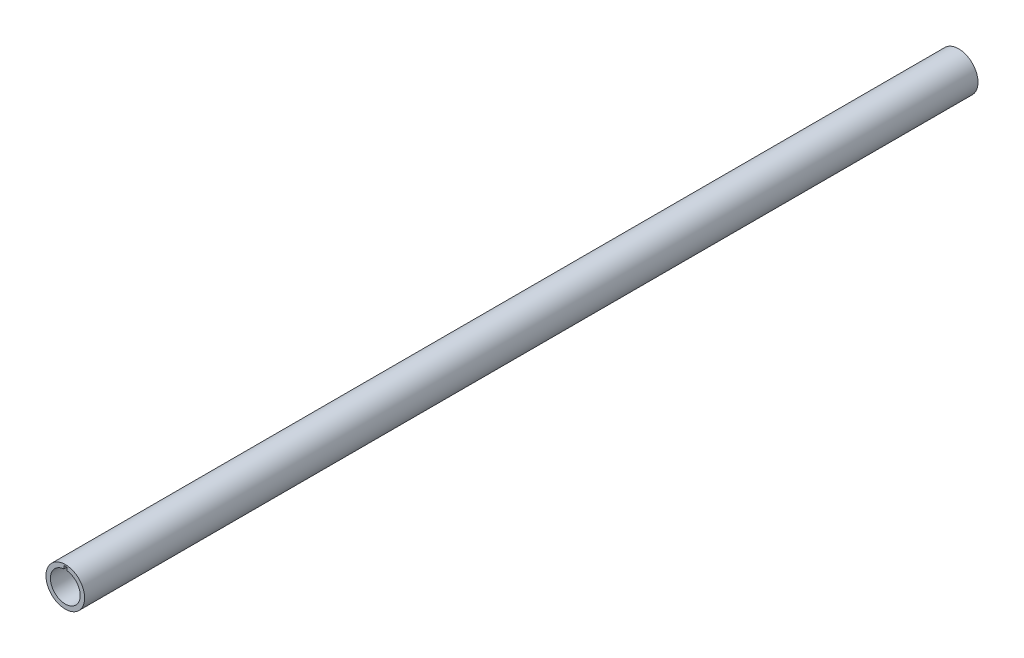
ISO-10303-21;
HEADER;
FILE_DESCRIPTION(('STEP AP214'),'2;1');
FILE_NAME('part.step','',(''),(''),'','','');
FILE_SCHEMA(('AUTOMOTIVE_DESIGN { 1 0 10303 214 1 1 1 1 }'));
ENDSEC;
DATA;
#1=APPLICATION_CONTEXT('core data for automotive mechanical design processes');
#2=APPLICATION_PROTOCOL_DEFINITION('international standard','automotive_design',2000,#1);
#3=PRODUCT_CONTEXT('',#1,'mechanical');
#4=PRODUCT('Part','Part','',(#3));
#5=PRODUCT_RELATED_PRODUCT_CATEGORY('part','',(#4));
#6=PRODUCT_DEFINITION_FORMATION('','',#4);
#7=PRODUCT_DEFINITION_CONTEXT('part definition',#1,'design');
#8=PRODUCT_DEFINITION('design','',#6,#7);
#9=PRODUCT_DEFINITION_SHAPE('','',#8);
#10=(LENGTH_UNIT() NAMED_UNIT(*) SI_UNIT(.MILLI.,.METRE.));
#11=(NAMED_UNIT(*) PLANE_ANGLE_UNIT() SI_UNIT($,.RADIAN.));
#12=(NAMED_UNIT(*) SI_UNIT($,.STERADIAN.) SOLID_ANGLE_UNIT());
#13=UNCERTAINTY_MEASURE_WITH_UNIT(LENGTH_MEASURE(1.E-05),#10,'distance_accuracy_value','');
#14=(GEOMETRIC_REPRESENTATION_CONTEXT(3) GLOBAL_UNCERTAINTY_ASSIGNED_CONTEXT((#13)) GLOBAL_UNIT_ASSIGNED_CONTEXT((#10,
#11,#12)) REPRESENTATION_CONTEXT('',''));
#15=CARTESIAN_POINT('',(0.,0.,0.));
#16=DIRECTION('',(0.,0.,1.));
#17=DIRECTION('',(1.,0.,0.));
#18=AXIS2_PLACEMENT_3D('',#15,#16,#17);
#19=CARTESIAN_POINT('',(0.,0.,600.));
#20=DIRECTION('',(0.,0.,1.));
#21=DIRECTION('',(1.,0.,0.));
#22=AXIS2_PLACEMENT_3D('',#19,#20,#21);
#23=PLANE('',#22);
#24=DIRECTION('',(0.,1.,0.));
#25=VECTOR('',#24,1.);
#26=CARTESIAN_POINT('',(1.,9.9498743710662,600.));
#27=LINE('',#26,#25);
#28=CARTESIAN_POINT('',(1.,9.9498743710662,600.));
#29=VERTEX_POINT('',#28);
#30=CARTESIAN_POINT('',(1.,12.,600.));
#31=VERTEX_POINT('',#30);
#32=EDGE_CURVE('E134',#29,#31,#27,.T.);
#33=ORIENTED_EDGE('',*,*,#32,.F.);
#34=CARTESIAN_POINT('',(0.,0.,600.));
#35=DIRECTION('',(0.,0.,1.));
#36=DIRECTION('',(1.,0.,0.));
#37=AXIS2_PLACEMENT_3D('',#34,#35,#36);
#38=CIRCLE('',#37,10.);
#39=CARTESIAN_POINT('',(-1.,9.9498743710662,600.));
#40=VERTEX_POINT('',#39);
#41=EDGE_CURVE('E164',#40,#29,#38,.T.);
#42=ORIENTED_EDGE('',*,*,#41,.F.);
#43=DIRECTION('',(0.,-1.,0.));
#44=VECTOR('',#43,1.);
#45=CARTESIAN_POINT('',(-1.,9.9498743710662,600.));
#46=LINE('',#45,#44);
#47=CARTESIAN_POINT('',(-1.,12.,600.));
#48=VERTEX_POINT('',#47);
#49=EDGE_CURVE('E143',#48,#40,#46,.T.);
#50=ORIENTED_EDGE('',*,*,#49,.F.);
#51=DIRECTION('',(-1.,0.,0.));
#52=VECTOR('',#51,1.);
#53=CARTESIAN_POINT('',(-1.,12.,600.));
#54=LINE('',#53,#52);
#55=EDGE_CURVE('E151',#31,#48,#54,.T.);
#56=ORIENTED_EDGE('',*,*,#55,.F.);
#57=EDGE_LOOP('',(#33,#42,#50,#56));
#58=FACE_BOUND('',#57,.T.);
#59=CARTESIAN_POINT('',(0.,0.,600.));
#60=DIRECTION('',(0.,0.,1.));
#61=DIRECTION('',(1.,0.,0.));
#62=AXIS2_PLACEMENT_3D('',#59,#60,#61);
#63=CIRCLE('',#62,13.);
#64=CARTESIAN_POINT('',(13.,0.,600.));
#65=VERTEX_POINT('',#64);
#66=EDGE_CURVE('E11',#65,#65,#63,.T.);
#67=ORIENTED_EDGE('',*,*,#66,.T.);
#68=EDGE_LOOP('',(#67));
#69=FACE_BOUND('',#68,.T.);
#70=ADVANCED_FACE('F36',(#58,#69),#23,.T.);
#71=CARTESIAN_POINT('',(0.,0.,0.));
#72=DIRECTION('',(0.,0.,1.));
#73=DIRECTION('',(1.,0.,0.));
#74=AXIS2_PLACEMENT_3D('',#71,#72,#73);
#75=PLANE('',#74);
#76=CARTESIAN_POINT('',(0.,0.,0.));
#77=DIRECTION('',(0.,0.,1.));
#78=DIRECTION('',(1.,0.,0.));
#79=AXIS2_PLACEMENT_3D('',#76,#77,#78);
#80=CIRCLE('',#79,13.);
#81=CARTESIAN_POINT('',(13.,0.,0.));
#82=VERTEX_POINT('',#81);
#83=EDGE_CURVE('E40',#82,#82,#80,.T.);
#84=ORIENTED_EDGE('',*,*,#83,.F.);
#85=EDGE_LOOP('',(#84));
#86=FACE_BOUND('',#85,.T.);
#87=DIRECTION('',(1.,0.,0.));
#88=VECTOR('',#87,1.);
#89=CARTESIAN_POINT('',(1.,11.9498743710662,0.));
#90=LINE('',#89,#88);
#91=CARTESIAN_POINT('',(-1.,11.9498743710662,0.));
#92=VERTEX_POINT('',#91);
#93=CARTESIAN_POINT('',(1.,11.9498743710662,0.));
#94=VERTEX_POINT('',#93);
#95=EDGE_CURVE('E125',#92,#94,#90,.T.);
#96=ORIENTED_EDGE('',*,*,#95,.F.);
#97=DIRECTION('',(0.,1.,0.));
#98=VECTOR('',#97,1.);
#99=CARTESIAN_POINT('',(-1.,9.9498743710662,0.));
#100=LINE('',#99,#98);
#101=CARTESIAN_POINT('',(-1.,9.9498743710662,0.));
#102=VERTEX_POINT('',#101);
#103=EDGE_CURVE('E110',#102,#92,#100,.T.);
#104=ORIENTED_EDGE('',*,*,#103,.F.);
#105=CARTESIAN_POINT('',(0.,0.,0.));
#106=DIRECTION('',(0.,0.,1.));
#107=DIRECTION('',(1.,0.,0.));
#108=AXIS2_PLACEMENT_3D('',#105,#106,#107);
#109=CIRCLE('',#108,10.);
#110=CARTESIAN_POINT('',(1.,9.9498743710662,0.));
#111=VERTEX_POINT('',#110);
#112=EDGE_CURVE('E157',#102,#111,#109,.T.);
#113=ORIENTED_EDGE('',*,*,#112,.T.);
#114=DIRECTION('',(0.,-1.,0.));
#115=VECTOR('',#114,1.);
#116=CARTESIAN_POINT('',(1.,9.9498743710662,0.));
#117=LINE('',#116,#115);
#118=EDGE_CURVE('E123',#94,#111,#117,.T.);
#119=ORIENTED_EDGE('',*,*,#118,.F.);
#120=EDGE_LOOP('',(#96,#104,#113,#119));
#121=FACE_BOUND('',#120,.T.);
#122=ADVANCED_FACE('F171',(#86,#121),#75,.F.);
#123=CARTESIAN_POINT('',(0.,0.,600.));
#124=DIRECTION('',(0.,0.,-1.));
#125=DIRECTION('',(-1.,0.,0.));
#126=AXIS2_PLACEMENT_3D('',#123,#124,#125);
#127=CYLINDRICAL_SURFACE('',#126,13.);
#128=ORIENTED_EDGE('',*,*,#66,.F.);
#129=EDGE_LOOP('',(#128));
#130=FACE_BOUND('',#129,.T.);
#131=ORIENTED_EDGE('',*,*,#83,.T.);
#132=EDGE_LOOP('',(#131));
#133=FACE_BOUND('',#132,.T.);
#134=ADVANCED_FACE('F38',(#130,#133),#127,.T.);
#135=CARTESIAN_POINT('',(0.,0.,600.));
#136=DIRECTION('',(0.,0.,-1.));
#137=DIRECTION('',(-1.,0.,0.));
#138=AXIS2_PLACEMENT_3D('',#135,#136,#137);
#139=CYLINDRICAL_SURFACE('',#138,10.);
#140=DIRECTION('',(0.,0.,-1.));
#141=VECTOR('',#140,1.);
#142=CARTESIAN_POINT('',(-1.,9.9498743710662,20.));
#143=LINE('',#142,#141);
#144=CARTESIAN_POINT('',(-1.,9.9498743710662,20.));
#145=VERTEX_POINT('',#144);
#146=EDGE_CURVE('E132',#145,#102,#143,.T.);
#147=ORIENTED_EDGE('',*,*,#146,.F.);
#148=CARTESIAN_POINT('',(0.,0.,20.));
#149=DIRECTION('',(0.,0.,1.));
#150=DIRECTION('',(-1.,0.,0.));
#151=AXIS2_PLACEMENT_3D('',#148,#149,#150);
#152=CIRCLE('',#151,10.);
#153=CARTESIAN_POINT('',(1.,9.9498743710662,20.));
#154=VERTEX_POINT('',#153);
#155=EDGE_CURVE('E115',#154,#145,#152,.T.);
#156=ORIENTED_EDGE('',*,*,#155,.F.);
#157=DIRECTION('',(0.,0.,-1.));
#158=VECTOR('',#157,1.);
#159=CARTESIAN_POINT('',(1.,9.9498743710662,20.));
#160=LINE('',#159,#158);
#161=EDGE_CURVE('E135',#154,#111,#160,.T.);
#162=ORIENTED_EDGE('',*,*,#161,.T.);
#163=ORIENTED_EDGE('',*,*,#112,.F.);
#164=EDGE_LOOP('',(#147,#156,#162,#163));
#165=FACE_BOUND('',#164,.T.);
#166=DIRECTION('',(0.,0.,1.));
#167=VECTOR('',#166,1.);
#168=CARTESIAN_POINT('',(1.,9.9498743710662,580.));
#169=LINE('',#168,#167);
#170=CARTESIAN_POINT('',(1.,9.9498743710662,580.));
#171=VERTEX_POINT('',#170);
#172=EDGE_CURVE('E155',#171,#29,#169,.T.);
#173=ORIENTED_EDGE('',*,*,#172,.F.);
#174=CARTESIAN_POINT('',(0.,0.,580.));
#175=DIRECTION('',(0.,0.,-1.));
#176=DIRECTION('',(1.,0.,0.));
#177=AXIS2_PLACEMENT_3D('',#174,#175,#176);
#178=CIRCLE('',#177,10.);
#179=CARTESIAN_POINT('',(-1.,9.9498743710662,580.));
#180=VERTEX_POINT('',#179);
#181=EDGE_CURVE('E146',#180,#171,#178,.T.);
#182=ORIENTED_EDGE('',*,*,#181,.F.);
#183=DIRECTION('',(0.,0.,1.));
#184=VECTOR('',#183,1.);
#185=CARTESIAN_POINT('',(-1.,9.9498743710662,580.));
#186=LINE('',#185,#184);
#187=EDGE_CURVE('E158',#180,#40,#186,.T.);
#188=ORIENTED_EDGE('',*,*,#187,.T.);
#189=ORIENTED_EDGE('',*,*,#41,.T.);
#190=EDGE_LOOP('',(#173,#182,#188,#189));
#191=FACE_BOUND('',#190,.T.);
#192=ADVANCED_FACE('F173',(#165,#191),#139,.F.);
#193=CARTESIAN_POINT('',(1.,9.9498743710662,580.));
#194=DIRECTION('',(1.,0.,0.));
#195=DIRECTION('',(0.,0.,-1.));
#196=AXIS2_PLACEMENT_3D('',#193,#194,#195);
#197=PLANE('',#196);
#198=ORIENTED_EDGE('',*,*,#32,.T.);
#199=DIRECTION('',(0.,0.,1.));
#200=VECTOR('',#199,1.);
#201=CARTESIAN_POINT('',(1.,12.,580.));
#202=LINE('',#201,#200);
#203=CARTESIAN_POINT('',(1.,12.,580.));
#204=VERTEX_POINT('',#203);
#205=EDGE_CURVE('E148',#204,#31,#202,.T.);
#206=ORIENTED_EDGE('',*,*,#205,.F.);
#207=DIRECTION('',(0.,1.,0.));
#208=VECTOR('',#207,1.);
#209=CARTESIAN_POINT('',(1.,9.9498743710662,580.));
#210=LINE('',#209,#208);
#211=EDGE_CURVE('E139',#171,#204,#210,.T.);
#212=ORIENTED_EDGE('',*,*,#211,.F.);
#213=ORIENTED_EDGE('',*,*,#172,.T.);
#214=EDGE_LOOP('',(#198,#206,#212,#213));
#215=FACE_BOUND('',#214,.T.);
#216=ADVANCED_FACE('F199',(#215),#197,.F.);
#217=CARTESIAN_POINT('',(-1.,9.9498743710662,580.));
#218=DIRECTION('',(-1.,0.,0.));
#219=DIRECTION('',(0.,0.,1.));
#220=AXIS2_PLACEMENT_3D('',#217,#218,#219);
#221=PLANE('',#220);
#222=ORIENTED_EDGE('',*,*,#49,.T.);
#223=ORIENTED_EDGE('',*,*,#187,.F.);
#224=DIRECTION('',(0.,-1.,0.));
#225=VECTOR('',#224,1.);
#226=CARTESIAN_POINT('',(-1.,9.9498743710662,580.));
#227=LINE('',#226,#225);
#228=CARTESIAN_POINT('',(-1.,12.,580.));
#229=VERTEX_POINT('',#228);
#230=EDGE_CURVE('E59',#229,#180,#227,.T.);
#231=ORIENTED_EDGE('',*,*,#230,.F.);
#232=DIRECTION('',(0.,0.,1.));
#233=VECTOR('',#232,1.);
#234=CARTESIAN_POINT('',(-1.,12.,580.));
#235=LINE('',#234,#233);
#236=EDGE_CURVE('E161',#229,#48,#235,.T.);
#237=ORIENTED_EDGE('',*,*,#236,.T.);
#238=EDGE_LOOP('',(#222,#223,#231,#237));
#239=FACE_BOUND('',#238,.T.);
#240=ADVANCED_FACE('F202',(#239),#221,.F.);
#241=CARTESIAN_POINT('',(-1.,12.,580.));
#242=DIRECTION('',(0.,1.,0.));
#243=DIRECTION('',(0.,0.,1.));
#244=AXIS2_PLACEMENT_3D('',#241,#242,#243);
#245=PLANE('',#244);
#246=ORIENTED_EDGE('',*,*,#55,.T.);
#247=ORIENTED_EDGE('',*,*,#236,.F.);
#248=DIRECTION('',(-1.,0.,0.));
#249=VECTOR('',#248,1.);
#250=CARTESIAN_POINT('',(-1.,12.,580.));
#251=LINE('',#250,#249);
#252=EDGE_CURVE('E142',#204,#229,#251,.T.);
#253=ORIENTED_EDGE('',*,*,#252,.F.);
#254=ORIENTED_EDGE('',*,*,#205,.T.);
#255=EDGE_LOOP('',(#246,#247,#253,#254));
#256=FACE_BOUND('',#255,.T.);
#257=ADVANCED_FACE('F204',(#256),#245,.F.);
#258=CARTESIAN_POINT('',(0.,0.,580.));
#259=DIRECTION('',(0.,0.,1.));
#260=DIRECTION('',(1.,0.,0.));
#261=AXIS2_PLACEMENT_3D('',#258,#259,#260);
#262=PLANE('',#261);
#263=ORIENTED_EDGE('',*,*,#211,.T.);
#264=ORIENTED_EDGE('',*,*,#252,.T.);
#265=ORIENTED_EDGE('',*,*,#230,.T.);
#266=ORIENTED_EDGE('',*,*,#181,.T.);
#267=EDGE_LOOP('',(#263,#264,#265,#266));
#268=FACE_BOUND('',#267,.T.);
#269=ADVANCED_FACE('F184',(#268),#262,.T.);
#270=CARTESIAN_POINT('',(-1.,9.9498743710662,20.));
#271=DIRECTION('',(-1.,0.,0.));
#272=DIRECTION('',(0.,0.,1.));
#273=AXIS2_PLACEMENT_3D('',#270,#271,#272);
#274=PLANE('',#273);
#275=ORIENTED_EDGE('',*,*,#103,.T.);
#276=DIRECTION('',(0.,0.,-1.));
#277=VECTOR('',#276,1.);
#278=CARTESIAN_POINT('',(-1.,11.9498743710662,20.));
#279=LINE('',#278,#277);
#280=CARTESIAN_POINT('',(-1.,11.9498743710662,20.));
#281=VERTEX_POINT('',#280);
#282=EDGE_CURVE('E104',#281,#92,#279,.T.);
#283=ORIENTED_EDGE('',*,*,#282,.F.);
#284=DIRECTION('',(0.,1.,0.));
#285=VECTOR('',#284,1.);
#286=CARTESIAN_POINT('',(-1.,9.9498743710662,20.));
#287=LINE('',#286,#285);
#288=EDGE_CURVE('E108',#145,#281,#287,.T.);
#289=ORIENTED_EDGE('',*,*,#288,.F.);
#290=ORIENTED_EDGE('',*,*,#146,.T.);
#291=EDGE_LOOP('',(#275,#283,#289,#290));
#292=FACE_BOUND('',#291,.T.);
#293=ADVANCED_FACE('F106',(#292),#274,.F.);
#294=CARTESIAN_POINT('',(1.,9.9498743710662,20.));
#295=DIRECTION('',(1.,0.,0.));
#296=DIRECTION('',(0.,0.,-1.));
#297=AXIS2_PLACEMENT_3D('',#294,#295,#296);
#298=PLANE('',#297);
#299=ORIENTED_EDGE('',*,*,#118,.T.);
#300=ORIENTED_EDGE('',*,*,#161,.F.);
#301=DIRECTION('',(0.,-1.,0.));
#302=VECTOR('',#301,1.);
#303=CARTESIAN_POINT('',(1.,9.9498743710662,20.));
#304=LINE('',#303,#302);
#305=CARTESIAN_POINT('',(1.,11.9498743710662,20.));
#306=VERTEX_POINT('',#305);
#307=EDGE_CURVE('E51',#306,#154,#304,.T.);
#308=ORIENTED_EDGE('',*,*,#307,.F.);
#309=DIRECTION('',(0.,0.,-1.));
#310=VECTOR('',#309,1.);
#311=CARTESIAN_POINT('',(1.,11.9498743710662,20.));
#312=LINE('',#311,#310);
#313=EDGE_CURVE('E114',#306,#94,#312,.T.);
#314=ORIENTED_EDGE('',*,*,#313,.T.);
#315=EDGE_LOOP('',(#299,#300,#308,#314));
#316=FACE_BOUND('',#315,.T.);
#317=ADVANCED_FACE('F176',(#316),#298,.F.);
#318=CARTESIAN_POINT('',(1.,11.9498743710662,20.));
#319=DIRECTION('',(0.,1.,0.));
#320=DIRECTION('',(0.,0.,1.));
#321=AXIS2_PLACEMENT_3D('',#318,#319,#320);
#322=PLANE('',#321);
#323=ORIENTED_EDGE('',*,*,#95,.T.);
#324=ORIENTED_EDGE('',*,*,#313,.F.);
#325=DIRECTION('',(1.,0.,0.));
#326=VECTOR('',#325,1.);
#327=CARTESIAN_POINT('',(1.,11.9498743710662,20.));
#328=LINE('',#327,#326);
#329=EDGE_CURVE('E117',#281,#306,#328,.T.);
#330=ORIENTED_EDGE('',*,*,#329,.F.);
#331=ORIENTED_EDGE('',*,*,#282,.T.);
#332=EDGE_LOOP('',(#323,#324,#330,#331));
#333=FACE_BOUND('',#332,.T.);
#334=ADVANCED_FACE('F118',(#333),#322,.F.);
#335=CARTESIAN_POINT('',(0.,0.,20.));
#336=DIRECTION('',(0.,0.,-1.));
#337=DIRECTION('',(-1.,0.,0.));
#338=AXIS2_PLACEMENT_3D('',#335,#336,#337);
#339=PLANE('',#338);
#340=ORIENTED_EDGE('',*,*,#288,.T.);
#341=ORIENTED_EDGE('',*,*,#329,.T.);
#342=ORIENTED_EDGE('',*,*,#307,.T.);
#343=ORIENTED_EDGE('',*,*,#155,.T.);
#344=EDGE_LOOP('',(#340,#341,#342,#343));
#345=FACE_BOUND('',#344,.T.);
#346=ADVANCED_FACE('F120',(#345),#339,.T.);
#347=CLOSED_SHELL('',(#70,#122,#134,#192,#216,#240,#257,#269,#293,#317,#334,#346));
#348=MANIFOLD_SOLID_BREP('B2',#347);
#349=ADVANCED_BREP_SHAPE_REPRESENTATION('',(#18,#348),#14);
#350=SHAPE_DEFINITION_REPRESENTATION(#9,#349);
ENDSEC;
END-ISO-10303-21;
